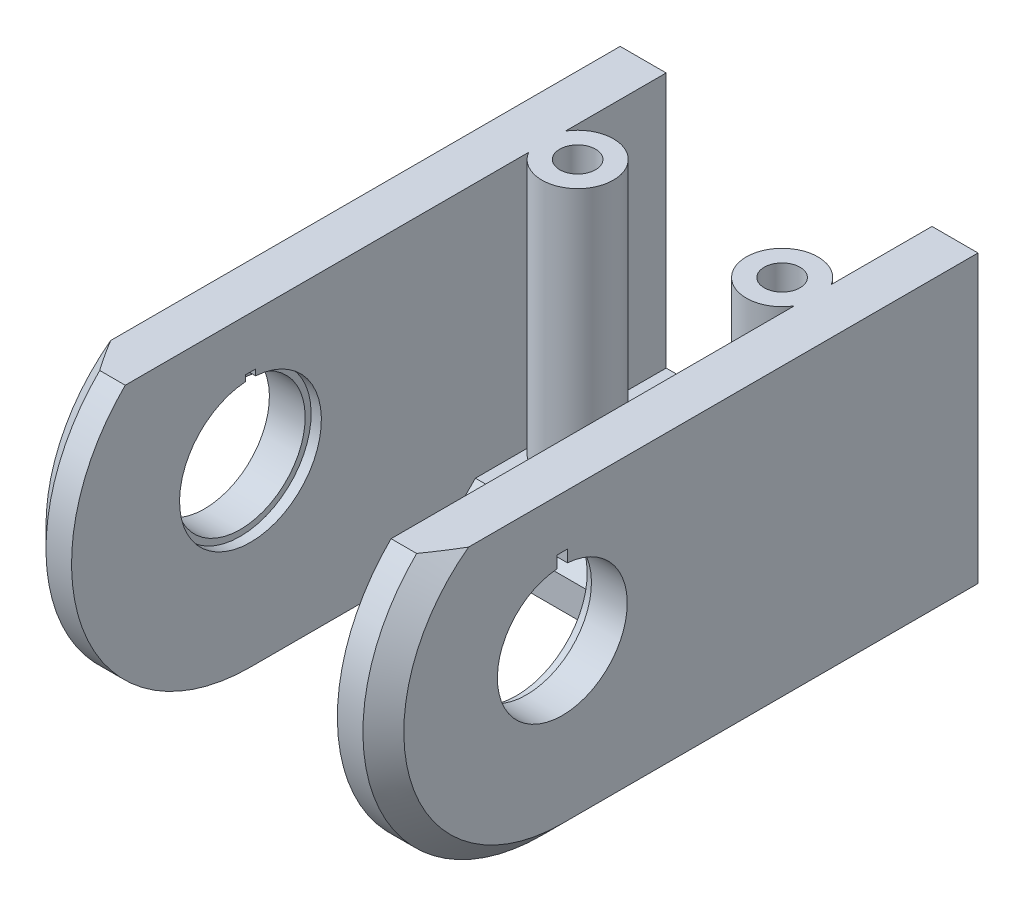
ISO-10303-21;
HEADER;
FILE_DESCRIPTION(('STEP AP214'),'2;1');
FILE_NAME('part.step','',(''),(''),'','','');
FILE_SCHEMA(('AUTOMOTIVE_DESIGN { 1 0 10303 214 1 1 1 1 }'));
ENDSEC;
DATA;
#1=APPLICATION_CONTEXT('core data for automotive mechanical design processes');
#2=APPLICATION_PROTOCOL_DEFINITION('international standard','automotive_design',2000,#1);
#3=PRODUCT_CONTEXT('',#1,'mechanical');
#4=PRODUCT('Part','Part','',(#3));
#5=PRODUCT_RELATED_PRODUCT_CATEGORY('part','',(#4));
#6=PRODUCT_DEFINITION_FORMATION('','',#4);
#7=PRODUCT_DEFINITION_CONTEXT('part definition',#1,'design');
#8=PRODUCT_DEFINITION('design','',#6,#7);
#9=PRODUCT_DEFINITION_SHAPE('','',#8);
#10=(LENGTH_UNIT() NAMED_UNIT(*) SI_UNIT(.MILLI.,.METRE.));
#11=(NAMED_UNIT(*) PLANE_ANGLE_UNIT() SI_UNIT($,.RADIAN.));
#12=(NAMED_UNIT(*) SI_UNIT($,.STERADIAN.) SOLID_ANGLE_UNIT());
#13=UNCERTAINTY_MEASURE_WITH_UNIT(LENGTH_MEASURE(1.E-05),#10,'distance_accuracy_value','');
#14=(GEOMETRIC_REPRESENTATION_CONTEXT(3) GLOBAL_UNCERTAINTY_ASSIGNED_CONTEXT((#13)) GLOBAL_UNIT_ASSIGNED_CONTEXT((#10,
#11,#12)) REPRESENTATION_CONTEXT('',''));
#15=CARTESIAN_POINT('',(0.,0.,0.));
#16=DIRECTION('',(0.,0.,1.));
#17=DIRECTION('',(1.,0.,0.));
#18=AXIS2_PLACEMENT_3D('',#15,#16,#17);
#19=CARTESIAN_POINT('',(17.5,0.,75.));
#20=DIRECTION('',(-1.,0.,0.));
#21=DIRECTION('',(0.,0.,1.));
#22=AXIS2_PLACEMENT_3D('',#19,#20,#21);
#23=CYLINDRICAL_SURFACE('',#22,6.35);
#24=DIRECTION('',(-1.,0.,0.));
#25=VECTOR('',#24,1.);
#26=CARTESIAN_POINT('',(17.5,6.33028435380275,74.5));
#27=LINE('',#26,#25);
#28=CARTESIAN_POINT('',(-17.5,6.33028435380275,74.5));
#29=VERTEX_POINT('',#28);
#30=CARTESIAN_POINT('',(-14.,6.33028435380275,74.5));
#31=VERTEX_POINT('',#30);
#32=EDGE_CURVE('E283',#29,#31,#27,.F.);
#33=ORIENTED_EDGE('',*,*,#32,.F.);
#34=CARTESIAN_POINT('',(-17.5,0.,75.));
#35=DIRECTION('',(1.,0.,0.));
#36=DIRECTION('',(0.,0.,-1.));
#37=AXIS2_PLACEMENT_3D('',#34,#35,#36);
#38=CIRCLE('',#37,6.35);
#39=CARTESIAN_POINT('',(-17.5,6.33028435380275,75.5));
#40=VERTEX_POINT('',#39);
#41=EDGE_CURVE('E410',#40,#29,#38,.T.);
#42=ORIENTED_EDGE('',*,*,#41,.F.);
#43=DIRECTION('',(-1.,0.,0.));
#44=VECTOR('',#43,1.);
#45=CARTESIAN_POINT('',(17.5,6.33028435380275,75.5));
#46=LINE('',#45,#44);
#47=CARTESIAN_POINT('',(-14.,6.33028435380275,75.5));
#48=VERTEX_POINT('',#47);
#49=EDGE_CURVE('E267',#48,#40,#46,.T.);
#50=ORIENTED_EDGE('',*,*,#49,.F.);
#51=CARTESIAN_POINT('',(-14.,0.,75.));
#52=DIRECTION('',(1.,0.,0.));
#53=DIRECTION('',(0.,0.,-1.));
#54=AXIS2_PLACEMENT_3D('',#51,#52,#53);
#55=CIRCLE('',#54,6.35);
#56=EDGE_CURVE('E306',#48,#31,#55,.T.);
#57=ORIENTED_EDGE('',*,*,#56,.T.);
#58=EDGE_LOOP('',(#33,#42,#50,#57));
#59=FACE_BOUND('',#58,.T.);
#60=ADVANCED_FACE('F37',(#59),#23,.F.);
#61=CARTESIAN_POINT('',(10.,-22.4497474683058,46.));
#62=DIRECTION('',(0.,1.,0.));
#63=DIRECTION('',(0.,0.,1.));
#64=AXIS2_PLACEMENT_3D('',#61,#62,#63);
#65=CYLINDRICAL_SURFACE('',#64,1.75);
#66=CARTESIAN_POINT('',(10.,12.5,46.));
#67=DIRECTION('',(0.,-1.,0.));
#68=DIRECTION('',(0.,0.,1.));
#69=AXIS2_PLACEMENT_3D('',#66,#67,#68);
#70=CIRCLE('',#69,1.75);
#71=CARTESIAN_POINT('',(10.,12.5,47.75));
#72=VERTEX_POINT('',#71);
#73=EDGE_CURVE('E316',#72,#72,#70,.T.);
#74=ORIENTED_EDGE('',*,*,#73,.F.);
#75=EDGE_LOOP('',(#74));
#76=FACE_BOUND('',#75,.T.);
#77=CARTESIAN_POINT('',(10.,-14.,46.));
#78=DIRECTION('',(0.,-1.,0.));
#79=DIRECTION('',(0.,0.,-1.));
#80=AXIS2_PLACEMENT_3D('',#77,#78,#79);
#81=CIRCLE('',#80,1.75);
#82=CARTESIAN_POINT('',(10.,-14.,44.25));
#83=VERTEX_POINT('',#82);
#84=EDGE_CURVE('E312',#83,#83,#81,.T.);
#85=ORIENTED_EDGE('',*,*,#84,.T.);
#86=EDGE_LOOP('',(#85));
#87=FACE_BOUND('',#86,.T.);
#88=ADVANCED_FACE('F501',(#76,#87),#65,.F.);
#89=CARTESIAN_POINT('',(13.,0.,-75.));
#90=DIRECTION('',(1.,0.,0.));
#91=DIRECTION('',(0.,0.,-1.));
#92=AXIS2_PLACEMENT_3D('',#89,#90,#91);
#93=PLANE('',#92);
#94=CARTESIAN_POINT('',(13.,0.,75.));
#95=DIRECTION('',(-1.,0.,0.));
#96=DIRECTION('',(0.,0.,1.));
#97=AXIS2_PLACEMENT_3D('',#94,#95,#96);
#98=CIRCLE('',#97,6.935);
#99=CARTESIAN_POINT('',(13.,6.91695200214661,74.5));
#100=VERTEX_POINT('',#99);
#101=CARTESIAN_POINT('',(13.,6.91695200214661,75.5));
#102=VERTEX_POINT('',#101);
#103=EDGE_CURVE('E328',#100,#102,#98,.T.);
#104=ORIENTED_EDGE('',*,*,#103,.F.);
#105=DIRECTION('',(0.,1.,0.));
#106=VECTOR('',#105,1.);
#107=CARTESIAN_POINT('',(13.,0.,74.5));
#108=LINE('',#107,#106);
#109=CARTESIAN_POINT('',(13.,7.5,74.5));
#110=VERTEX_POINT('',#109);
#111=EDGE_CURVE('E295',#100,#110,#108,.T.);
#112=ORIENTED_EDGE('',*,*,#111,.T.);
#113=DIRECTION('',(0.,0.,1.));
#114=VECTOR('',#113,1.);
#115=CARTESIAN_POINT('',(13.,7.5,-75.));
#116=LINE('',#115,#114);
#117=CARTESIAN_POINT('',(13.,7.5,75.5));
#118=VERTEX_POINT('',#117);
#119=EDGE_CURVE('E300',#110,#118,#116,.T.);
#120=ORIENTED_EDGE('',*,*,#119,.T.);
#121=DIRECTION('',(0.,-1.,0.));
#122=VECTOR('',#121,1.);
#123=CARTESIAN_POINT('',(13.,0.,75.5));
#124=LINE('',#123,#122);
#125=EDGE_CURVE('E239',#118,#102,#124,.T.);
#126=ORIENTED_EDGE('',*,*,#125,.T.);
#127=EDGE_LOOP('',(#104,#112,#120,#126));
#128=FACE_BOUND('',#127,.T.);
#129=DIRECTION('',(0.,0.,1.));
#130=VECTOR('',#129,1.);
#131=CARTESIAN_POINT('',(13.,12.5,92.5));
#132=LINE('',#131,#130);
#133=CARTESIAN_POINT('',(13.,12.5,47.802775637732));
#134=VERTEX_POINT('',#133);
#135=CARTESIAN_POINT('',(13.,12.5,87.2474487139159));
#136=VERTEX_POINT('',#135);
#137=EDGE_CURVE('E401',#134,#136,#132,.T.);
#138=ORIENTED_EDGE('',*,*,#137,.F.);
#139=DIRECTION('',(0.,-1.,0.));
#140=VECTOR('',#139,1.);
#141=CARTESIAN_POINT('',(13.,22.3994949366117,47.802775637732));
#142=LINE('',#141,#140);
#143=CARTESIAN_POINT('',(13.,-12.5,47.802775637732));
#144=VERTEX_POINT('',#143);
#145=EDGE_CURVE('E325',#134,#144,#142,.T.);
#146=ORIENTED_EDGE('',*,*,#145,.T.);
#147=DIRECTION('',(0.,0.,-1.));
#148=VECTOR('',#147,1.);
#149=CARTESIAN_POINT('',(13.,-12.5,55.));
#150=LINE('',#149,#148);
#151=CARTESIAN_POINT('',(13.,-12.5,53.));
#152=VERTEX_POINT('',#151);
#153=EDGE_CURVE('E398',#152,#144,#150,.T.);
#154=ORIENTED_EDGE('',*,*,#153,.F.);
#155=DIRECTION('',(0.,0.707106781186548,-0.707106781186548));
#156=VECTOR('',#155,1.);
#157=CARTESIAN_POINT('',(13.,57.75,-17.25));
#158=LINE('',#157,#156);
#159=CARTESIAN_POINT('',(13.,-14.5,55.));
#160=VERTEX_POINT('',#159);
#161=EDGE_CURVE('E607',#152,#160,#158,.F.);
#162=ORIENTED_EDGE('',*,*,#161,.T.);
#163=DIRECTION('',(0.,1.,0.));
#164=VECTOR('',#163,1.);
#165=CARTESIAN_POINT('',(13.,-12.5,55.));
#166=LINE('',#165,#164);
#167=CARTESIAN_POINT('',(13.,-17.5,55.));
#168=VERTEX_POINT('',#167);
#169=EDGE_CURVE('E393',#168,#160,#166,.T.);
#170=ORIENTED_EDGE('',*,*,#169,.F.);
#171=DIRECTION('',(0.,0.,-1.));
#172=VECTOR('',#171,1.);
#173=CARTESIAN_POINT('',(13.,-17.5,55.));
#174=LINE('',#173,#172);
#175=CARTESIAN_POINT('',(13.,-17.5,75.));
#176=VERTEX_POINT('',#175);
#177=EDGE_CURVE('E390',#176,#168,#174,.T.);
#178=ORIENTED_EDGE('',*,*,#177,.F.);
#179=CARTESIAN_POINT('',(13.,0.,75.));
#180=DIRECTION('',(1.,0.,0.));
#181=DIRECTION('',(0.,0.,-1.));
#182=AXIS2_PLACEMENT_3D('',#179,#180,#181);
#183=CIRCLE('',#182,17.5);
#184=EDGE_CURVE('E405',#136,#176,#183,.T.);
#185=ORIENTED_EDGE('',*,*,#184,.F.);
#186=EDGE_LOOP('',(#138,#146,#154,#162,#170,#178,#185));
#187=FACE_BOUND('',#186,.T.);
#188=ADVANCED_FACE('F508',(#128,#187),#93,.F.);
#189=DIRECTION('',(-1.,0.,0.));
#190=VECTOR('',#189,1.);
#191=CARTESIAN_POINT('',(17.5,6.33028435380275,74.5));
#192=LINE('',#191,#190);
#193=CARTESIAN_POINT('',(14.,6.33028435380275,74.5));
#194=VERTEX_POINT('',#193);
#195=CARTESIAN_POINT('',(17.5,6.33028435380275,74.5));
#196=VERTEX_POINT('',#195);
#197=EDGE_CURVE('E293',#194,#196,#192,.F.);
#198=ORIENTED_EDGE('',*,*,#197,.F.);
#199=CARTESIAN_POINT('',(14.,0.,75.));
#200=DIRECTION('',(-1.,0.,0.));
#201=DIRECTION('',(0.,0.,1.));
#202=AXIS2_PLACEMENT_3D('',#199,#200,#201);
#203=CIRCLE('',#202,6.35);
#204=CARTESIAN_POINT('',(14.,6.33028435380275,75.5));
#205=VERTEX_POINT('',#204);
#206=EDGE_CURVE('E332',#194,#205,#203,.T.);
#207=ORIENTED_EDGE('',*,*,#206,.T.);
#208=DIRECTION('',(-1.,0.,0.));
#209=VECTOR('',#208,1.);
#210=CARTESIAN_POINT('',(17.5,6.33028435380275,75.5));
#211=LINE('',#210,#209);
#212=CARTESIAN_POINT('',(17.5,6.33028435380275,75.5));
#213=VERTEX_POINT('',#212);
#214=EDGE_CURVE('E53',#213,#205,#211,.T.);
#215=ORIENTED_EDGE('',*,*,#214,.F.);
#216=CARTESIAN_POINT('',(17.5,0.,75.));
#217=DIRECTION('',(1.,0.,0.));
#218=DIRECTION('',(0.,0.,-1.));
#219=AXIS2_PLACEMENT_3D('',#216,#217,#218);
#220=CIRCLE('',#219,6.35);
#221=EDGE_CURVE('E258',#213,#196,#220,.T.);
#222=ORIENTED_EDGE('',*,*,#221,.T.);
#223=EDGE_LOOP('',(#198,#207,#215,#222));
#224=FACE_BOUND('',#223,.T.);
#225=ADVANCED_FACE('F504',(#224),#23,.F.);
#226=CARTESIAN_POINT('',(17.5,12.5,87.2474487139159));
#227=DIRECTION('',(0.,-1.,0.));
#228=DIRECTION('',(0.,0.,-1.));
#229=AXIS2_PLACEMENT_3D('',#226,#227,#228);
#230=PLANE('',#229);
#231=ORIENTED_EDGE('',*,*,#73,.T.);
#232=EDGE_LOOP('',(#231));
#233=FACE_BOUND('',#232,.T.);
#234=CARTESIAN_POINT('',(13.,12.5,34.3424314864507));
#235=VERTEX_POINT('',#234);
#236=CARTESIAN_POINT('',(13.,12.5,44.197224362268));
#237=VERTEX_POINT('',#236);
#238=EDGE_CURVE('E379',#235,#237,#132,.T.);
#239=ORIENTED_EDGE('',*,*,#238,.T.);
#240=CARTESIAN_POINT('',(10.,12.5,46.));
#241=DIRECTION('',(0.,-1.,0.));
#242=DIRECTION('',(0.,0.,-1.));
#243=AXIS2_PLACEMENT_3D('',#240,#241,#242);
#244=CIRCLE('',#243,3.50000000000001);
#245=EDGE_CURVE('E319',#237,#134,#244,.F.);
#246=ORIENTED_EDGE('',*,*,#245,.T.);
#247=ORIENTED_EDGE('',*,*,#137,.T.);
#248=DIRECTION('',(-1.,0.,0.));
#249=VECTOR('',#248,1.);
#250=CARTESIAN_POINT('',(17.5,12.5,87.2474487139159));
#251=LINE('',#250,#249);
#252=CARTESIAN_POINT('',(15.5,12.5,87.2474487139159));
#253=VERTEX_POINT('',#252);
#254=EDGE_CURVE('E419',#253,#136,#251,.T.);
#255=ORIENTED_EDGE('',*,*,#254,.F.);
#256=CARTESIAN_POINT('',(15.5,12.5,87.2474487139159));
#257=CARTESIAN_POINT('',(15.6756172945295,12.5,86.9964877108867));
#258=CARTESIAN_POINT('',(15.8494169532669,12.5,86.7442419059624));
#259=CARTESIAN_POINT('',(16.1927194087836,12.5,86.2369787479366));
#260=CARTESIAN_POINT('',(16.3622237420843,12.5,85.9819624339059));
#261=CARTESIAN_POINT('',(16.6964135222086,12.5,85.4687573416287));
#262=CARTESIAN_POINT('',(16.8610986444784,12.5,85.210568351371));
#263=CARTESIAN_POINT('',(17.1849216002896,12.5,84.6906080472939));
#264=CARTESIAN_POINT('',(17.3440573963148,12.5,84.4288354658246));
#265=CARTESIAN_POINT('',(17.5,12.5,84.1651513899116));
#266=B_SPLINE_CURVE_WITH_KNOTS('',3,(#256,#257,#258,#259,#260,#261,#262,#263,#264,#265),
.UNSPECIFIED.,.F.,.F.,(4,2,2,2,4),(0.,0.918922488747973,1.83751148308626,2.75616219883708,
3.67514673333104),.UNSPECIFIED.);
#267=CARTESIAN_POINT('',(17.5,12.5,84.1651513899117));
#268=VERTEX_POINT('',#267);
#269=EDGE_CURVE('E438',#253,#268,#266,.T.);
#270=ORIENTED_EDGE('',*,*,#269,.T.);
#271=DIRECTION('',(0.,0.,1.));
#272=VECTOR('',#271,1.);
#273=CARTESIAN_POINT('',(17.5,12.5,87.2474487139159));
#274=LINE('',#273,#272);
#275=CARTESIAN_POINT('',(17.5,12.5,34.3424314864507));
#276=VERTEX_POINT('',#275);
#277=EDGE_CURVE('E415',#276,#268,#274,.T.);
#278=ORIENTED_EDGE('',*,*,#277,.F.);
#279=DIRECTION('',(-1.,0.,0.));
#280=VECTOR('',#279,1.);
#281=CARTESIAN_POINT('',(17.5,12.5,34.3424314864507));
#282=LINE('',#281,#280);
#283=EDGE_CURVE('E351',#276,#235,#282,.T.);
#284=ORIENTED_EDGE('',*,*,#283,.T.);
#285=EDGE_LOOP('',(#239,#246,#247,#255,#270,#278,#284));
#286=FACE_BOUND('',#285,.T.);
#287=ADVANCED_FACE('F464',(#233,#286),#230,.F.);
#288=CARTESIAN_POINT('',(-10.,-22.4497474683058,46.));
#289=DIRECTION('',(0.,1.,0.));
#290=DIRECTION('',(0.,0.,1.));
#291=AXIS2_PLACEMENT_3D('',#288,#289,#290);
#292=CYLINDRICAL_SURFACE('',#291,1.75);
#293=CARTESIAN_POINT('',(-10.,12.5,46.));
#294=DIRECTION('',(0.,1.,0.));
#295=DIRECTION('',(0.,0.,1.));
#296=AXIS2_PLACEMENT_3D('',#293,#294,#295);
#297=CIRCLE('',#296,1.75);
#298=CARTESIAN_POINT('',(-10.,12.5,47.75));
#299=VERTEX_POINT('',#298);
#300=EDGE_CURVE('E364',#299,#299,#297,.T.);
#301=ORIENTED_EDGE('',*,*,#300,.T.);
#302=EDGE_LOOP('',(#301));
#303=FACE_BOUND('',#302,.T.);
#304=CARTESIAN_POINT('',(-10.,-14.,46.));
#305=DIRECTION('',(0.,-1.,0.));
#306=DIRECTION('',(0.,0.,-1.));
#307=AXIS2_PLACEMENT_3D('',#304,#305,#306);
#308=CIRCLE('',#307,1.75);
#309=CARTESIAN_POINT('',(-10.,-14.,44.25));
#310=VERTEX_POINT('',#309);
#311=EDGE_CURVE('E360',#310,#310,#308,.F.);
#312=ORIENTED_EDGE('',*,*,#311,.F.);
#313=EDGE_LOOP('',(#312));
#314=FACE_BOUND('',#313,.T.);
#315=ADVANCED_FACE('F519',(#303,#314),#292,.F.);
#316=CARTESIAN_POINT('',(-13.,0.,-75.));
#317=DIRECTION('',(1.,0.,0.));
#318=DIRECTION('',(0.,0.,-1.));
#319=AXIS2_PLACEMENT_3D('',#316,#317,#318);
#320=PLANE('',#319);
#321=DIRECTION('',(0.,1.,0.));
#322=VECTOR('',#321,1.);
#323=CARTESIAN_POINT('',(-13.,0.,74.5));
#324=LINE('',#323,#322);
#325=CARTESIAN_POINT('',(-13.,6.91695200214661,74.5));
#326=VERTEX_POINT('',#325);
#327=CARTESIAN_POINT('',(-13.,7.5,74.5));
#328=VERTEX_POINT('',#327);
#329=EDGE_CURVE('E281',#326,#328,#324,.T.);
#330=ORIENTED_EDGE('',*,*,#329,.F.);
#331=CARTESIAN_POINT('',(-13.,0.,75.));
#332=DIRECTION('',(-1.,0.,0.));
#333=DIRECTION('',(0.,0.,1.));
#334=AXIS2_PLACEMENT_3D('',#331,#332,#333);
#335=CIRCLE('',#334,6.935);
#336=CARTESIAN_POINT('',(-13.,6.91695200214661,75.5));
#337=VERTEX_POINT('',#336);
#338=EDGE_CURVE('E302',#326,#337,#335,.T.);
#339=ORIENTED_EDGE('',*,*,#338,.T.);
#340=DIRECTION('',(0.,-1.,0.));
#341=VECTOR('',#340,1.);
#342=CARTESIAN_POINT('',(-13.,0.,75.5));
#343=LINE('',#342,#341);
#344=CARTESIAN_POINT('',(-13.,7.5,75.5));
#345=VERTEX_POINT('',#344);
#346=EDGE_CURVE('E265',#345,#337,#343,.T.);
#347=ORIENTED_EDGE('',*,*,#346,.F.);
#348=DIRECTION('',(0.,0.,1.));
#349=VECTOR('',#348,1.);
#350=CARTESIAN_POINT('',(-13.,7.5,-75.));
#351=LINE('',#350,#349);
#352=EDGE_CURVE('E298',#328,#345,#351,.T.);
#353=ORIENTED_EDGE('',*,*,#352,.F.);
#354=EDGE_LOOP('',(#330,#339,#347,#353));
#355=FACE_BOUND('',#354,.T.);
#356=DIRECTION('',(0.,0.,-1.));
#357=VECTOR('',#356,1.);
#358=CARTESIAN_POINT('',(-13.,-12.5,55.));
#359=LINE('',#358,#357);
#360=CARTESIAN_POINT('',(-13.,-12.5,53.));
#361=VERTEX_POINT('',#360);
#362=CARTESIAN_POINT('',(-13.,-12.5,47.802775637732));
#363=VERTEX_POINT('',#362);
#364=EDGE_CURVE('E383',#361,#363,#359,.T.);
#365=ORIENTED_EDGE('',*,*,#364,.T.);
#366=DIRECTION('',(0.,-1.,0.));
#367=VECTOR('',#366,1.);
#368=CARTESIAN_POINT('',(-13.,22.3994949366117,47.802775637732));
#369=LINE('',#368,#367);
#370=CARTESIAN_POINT('',(-13.,12.5,47.802775637732));
#371=VERTEX_POINT('',#370);
#372=EDGE_CURVE('E373',#363,#371,#369,.F.);
#373=ORIENTED_EDGE('',*,*,#372,.T.);
#374=DIRECTION('',(0.,0.,1.));
#375=VECTOR('',#374,1.);
#376=CARTESIAN_POINT('',(-13.,12.5,92.5));
#377=LINE('',#376,#375);
#378=CARTESIAN_POINT('',(-13.,12.5,87.2474487139159));
#379=VERTEX_POINT('',#378);
#380=EDGE_CURVE('E386',#371,#379,#377,.T.);
#381=ORIENTED_EDGE('',*,*,#380,.T.);
#382=CARTESIAN_POINT('',(-13.,0.,75.));
#383=DIRECTION('',(1.,0.,0.));
#384=DIRECTION('',(0.,0.,-1.));
#385=AXIS2_PLACEMENT_3D('',#382,#383,#384);
#386=CIRCLE('',#385,17.5);
#387=CARTESIAN_POINT('',(-13.,-17.5,75.));
#388=VERTEX_POINT('',#387);
#389=EDGE_CURVE('E408',#379,#388,#386,.T.);
#390=ORIENTED_EDGE('',*,*,#389,.T.);
#391=DIRECTION('',(0.,0.,-1.));
#392=VECTOR('',#391,1.);
#393=CARTESIAN_POINT('',(-13.,-17.5,55.));
#394=LINE('',#393,#392);
#395=CARTESIAN_POINT('',(-13.,-17.5,55.));
#396=VERTEX_POINT('',#395);
#397=EDGE_CURVE('E376',#388,#396,#394,.T.);
#398=ORIENTED_EDGE('',*,*,#397,.T.);
#399=DIRECTION('',(0.,1.,0.));
#400=VECTOR('',#399,1.);
#401=CARTESIAN_POINT('',(-13.,-12.5,55.));
#402=LINE('',#401,#400);
#403=CARTESIAN_POINT('',(-13.,-14.5,55.));
#404=VERTEX_POINT('',#403);
#405=EDGE_CURVE('E378',#396,#404,#402,.T.);
#406=ORIENTED_EDGE('',*,*,#405,.T.);
#407=DIRECTION('',(0.,-0.707106781186548,0.707106781186548));
#408=VECTOR('',#407,1.);
#409=CARTESIAN_POINT('',(-13.,-12.5,53.));
#410=LINE('',#409,#408);
#411=EDGE_CURVE('E578',#404,#361,#410,.F.);
#412=ORIENTED_EDGE('',*,*,#411,.T.);
#413=EDGE_LOOP('',(#365,#373,#381,#390,#398,#406,#412));
#414=FACE_BOUND('',#413,.T.);
#415=ADVANCED_FACE('F569',(#355,#414),#320,.T.);
#416=DIRECTION('',(0.,-1.,0.));
#417=VECTOR('',#416,1.);
#418=CARTESIAN_POINT('',(-13.,0.,34.3424314864507));
#419=LINE('',#418,#417);
#420=CARTESIAN_POINT('',(-13.,12.5,34.3424314864507));
#421=VERTEX_POINT('',#420);
#422=CARTESIAN_POINT('',(-13.,-12.5,34.3424314864507));
#423=VERTEX_POINT('',#422);
#424=EDGE_CURVE('E354',#421,#423,#419,.T.);
#425=ORIENTED_EDGE('',*,*,#424,.F.);
#426=CARTESIAN_POINT('',(-13.,12.5,44.197224362268));
#427=VERTEX_POINT('',#426);
#428=EDGE_CURVE('E387',#421,#427,#377,.T.);
#429=ORIENTED_EDGE('',*,*,#428,.T.);
#430=DIRECTION('',(0.,-1.,0.));
#431=VECTOR('',#430,1.);
#432=CARTESIAN_POINT('',(-13.,22.3994949366117,44.197224362268));
#433=LINE('',#432,#431);
#434=CARTESIAN_POINT('',(-13.,-12.5,44.197224362268));
#435=VERTEX_POINT('',#434);
#436=EDGE_CURVE('E370',#427,#435,#433,.T.);
#437=ORIENTED_EDGE('',*,*,#436,.T.);
#438=EDGE_CURVE('E382',#435,#423,#359,.T.);
#439=ORIENTED_EDGE('',*,*,#438,.T.);
#440=EDGE_LOOP('',(#425,#429,#437,#439));
#441=FACE_BOUND('',#440,.T.);
#442=ADVANCED_FACE('F572',(#441),#320,.T.);
#443=CARTESIAN_POINT('',(17.5,0.,75.));
#444=DIRECTION('',(-1.,0.,0.));
#445=DIRECTION('',(0.,0.,1.));
#446=AXIS2_PLACEMENT_3D('',#443,#444,#445);
#447=CYLINDRICAL_SURFACE('',#446,17.5);
#448=CARTESIAN_POINT('',(-15.5,12.5,87.2474487139159));
#449=VERTEX_POINT('',#448);
#450=EDGE_CURVE('E417',#379,#449,#251,.T.);
#451=ORIENTED_EDGE('',*,*,#450,.T.);
#452=CARTESIAN_POINT('',(-15.5,0.,75.));
#453=DIRECTION('',(1.,0.,0.));
#454=DIRECTION('',(0.,0.,-1.));
#455=AXIS2_PLACEMENT_3D('',#452,#453,#454);
#456=CIRCLE('',#455,17.5);
#457=CARTESIAN_POINT('',(-15.5,-17.5,75.));
#458=VERTEX_POINT('',#457);
#459=EDGE_CURVE('E430',#449,#458,#456,.T.);
#460=ORIENTED_EDGE('',*,*,#459,.T.);
#461=DIRECTION('',(-1.,0.,0.));
#462=VECTOR('',#461,1.);
#463=CARTESIAN_POINT('',(17.5,-17.5,75.));
#464=LINE('',#463,#462);
#465=EDGE_CURVE('E422',#388,#458,#464,.T.);
#466=ORIENTED_EDGE('',*,*,#465,.F.);
#467=ORIENTED_EDGE('',*,*,#389,.F.);
#468=EDGE_LOOP('',(#451,#460,#466,#467));
#469=FACE_BOUND('',#468,.T.);
#470=ADVANCED_FACE('F470',(#469),#447,.T.);
#471=CARTESIAN_POINT('',(17.5,-17.5,75.));
#472=DIRECTION('',(0.,1.,0.));
#473=DIRECTION('',(0.,0.,1.));
#474=AXIS2_PLACEMENT_3D('',#471,#472,#473);
#475=PLANE('',#474);
#476=CARTESIAN_POINT('',(10.,-17.5,46.));
#477=DIRECTION('',(0.,1.,0.));
#478=DIRECTION('',(0.,0.,-1.));
#479=AXIS2_PLACEMENT_3D('',#476,#477,#478);
#480=CIRCLE('',#479,2.5);
#481=CARTESIAN_POINT('',(10.,-17.5,43.5));
#482=VERTEX_POINT('',#481);
#483=EDGE_CURVE('E313',#482,#482,#480,.T.);
#484=ORIENTED_EDGE('',*,*,#483,.T.);
#485=EDGE_LOOP('',(#484));
#486=FACE_BOUND('',#485,.T.);
#487=CARTESIAN_POINT('',(-10.,-17.5,46.));
#488=DIRECTION('',(0.,-1.,0.));
#489=DIRECTION('',(0.,0.,-1.));
#490=AXIS2_PLACEMENT_3D('',#487,#488,#489);
#491=CIRCLE('',#490,2.5);
#492=CARTESIAN_POINT('',(-10.,-17.5,43.5));
#493=VERTEX_POINT('',#492);
#494=EDGE_CURVE('E361',#493,#493,#491,.T.);
#495=ORIENTED_EDGE('',*,*,#494,.F.);
#496=EDGE_LOOP('',(#495));
#497=FACE_BOUND('',#496,.T.);
#498=DIRECTION('',(0.,0.,-1.));
#499=VECTOR('',#498,1.);
#500=CARTESIAN_POINT('',(-15.5,-17.5,75.));
#501=LINE('',#500,#499);
#502=CARTESIAN_POINT('',(-15.5,-17.5,34.3424314864507));
#503=VERTEX_POINT('',#502);
#504=EDGE_CURVE('E601',#458,#503,#501,.T.);
#505=ORIENTED_EDGE('',*,*,#504,.T.);
#506=DIRECTION('',(1.,0.,0.));
#507=VECTOR('',#506,1.);
#508=CARTESIAN_POINT('',(17.5,-17.5,34.3424314864507));
#509=LINE('',#508,#507);
#510=CARTESIAN_POINT('',(15.5,-17.5,34.3424314864507));
#511=VERTEX_POINT('',#510);
#512=EDGE_CURVE('E338',#503,#511,#509,.T.);
#513=ORIENTED_EDGE('',*,*,#512,.T.);
#514=DIRECTION('',(0.,0.,1.));
#515=VECTOR('',#514,1.);
#516=CARTESIAN_POINT('',(15.5,-17.5,75.));
#517=LINE('',#516,#515);
#518=CARTESIAN_POINT('',(15.5,-17.5,75.));
#519=VERTEX_POINT('',#518);
#520=EDGE_CURVE('E925',#511,#519,#517,.T.);
#521=ORIENTED_EDGE('',*,*,#520,.T.);
#522=EDGE_CURVE('E423',#519,#176,#464,.T.);
#523=ORIENTED_EDGE('',*,*,#522,.T.);
#524=ORIENTED_EDGE('',*,*,#177,.T.);
#525=DIRECTION('',(1.,0.,0.));
#526=VECTOR('',#525,1.);
#527=CARTESIAN_POINT('',(-13.,-17.5,55.));
#528=LINE('',#527,#526);
#529=EDGE_CURVE('E389',#396,#168,#528,.T.);
#530=ORIENTED_EDGE('',*,*,#529,.F.);
#531=ORIENTED_EDGE('',*,*,#397,.F.);
#532=ORIENTED_EDGE('',*,*,#465,.T.);
#533=EDGE_LOOP('',(#505,#513,#521,#523,#524,#530,#531,#532));
#534=FACE_BOUND('',#533,.T.);
#535=ADVANCED_FACE('F462',(#486,#497,#534),#475,.F.);
#536=ORIENTED_EDGE('',*,*,#300,.F.);
#537=EDGE_LOOP('',(#536));
#538=FACE_BOUND('',#537,.T.);
#539=ORIENTED_EDGE('',*,*,#428,.F.);
#540=CARTESIAN_POINT('',(-17.5,12.5,34.3424314864507));
#541=VERTEX_POINT('',#540);
#542=EDGE_CURVE('E355',#421,#541,#282,.T.);
#543=ORIENTED_EDGE('',*,*,#542,.T.);
#544=DIRECTION('',(0.,0.,1.));
#545=VECTOR('',#544,1.);
#546=CARTESIAN_POINT('',(-17.5,12.5,87.2474487139159));
#547=LINE('',#546,#545);
#548=CARTESIAN_POINT('',(-17.5,12.5,84.1651513899117));
#549=VERTEX_POINT('',#548);
#550=EDGE_CURVE('E412',#541,#549,#547,.T.);
#551=ORIENTED_EDGE('',*,*,#550,.T.);
#552=CARTESIAN_POINT('',(-17.5,12.5,84.1651513899117));
#553=CARTESIAN_POINT('',(-17.3440573963148,12.5,84.4288354658246));
#554=CARTESIAN_POINT('',(-17.1849216002896,12.5,84.6906080472939));
#555=CARTESIAN_POINT('',(-16.8610986444784,12.5,85.210568351371));
#556=CARTESIAN_POINT('',(-16.6964135222086,12.5,85.4687573416288));
#557=CARTESIAN_POINT('',(-16.3622237420843,12.5,85.9819624339059));
#558=CARTESIAN_POINT('',(-16.1927194087836,12.5,86.2369787479367));
#559=CARTESIAN_POINT('',(-15.8494169532669,12.5,86.7442419059624));
#560=CARTESIAN_POINT('',(-15.6756172945295,12.5,86.9964877108867));
#561=CARTESIAN_POINT('',(-15.5,12.5,87.2474487139159));
#562=B_SPLINE_CURVE_WITH_KNOTS('',3,(#552,#553,#554,#555,#556,#557,#558,#559,#560,#561),
.UNSPECIFIED.,.F.,.F.,(4,2,2,2,4),(0.,0.918984534493964,1.83763525024478,2.75622424458305,
3.67514673333103),.UNSPECIFIED.);
#563=EDGE_CURVE('E446',#549,#449,#562,.T.);
#564=ORIENTED_EDGE('',*,*,#563,.T.);
#565=ORIENTED_EDGE('',*,*,#450,.F.);
#566=ORIENTED_EDGE('',*,*,#380,.F.);
#567=CARTESIAN_POINT('',(-10.,12.5,46.));
#568=DIRECTION('',(0.,-1.,0.));
#569=DIRECTION('',(0.,0.,-1.));
#570=AXIS2_PLACEMENT_3D('',#567,#568,#569);
#571=CIRCLE('',#570,3.50000000000001);
#572=EDGE_CURVE('E367',#427,#371,#571,.T.);
#573=ORIENTED_EDGE('',*,*,#572,.F.);
#574=EDGE_LOOP('',(#539,#543,#551,#564,#565,#566,#573));
#575=FACE_BOUND('',#574,.T.);
#576=ADVANCED_FACE('F457',(#538,#575),#230,.F.);
#577=CARTESIAN_POINT('',(17.5,0.,75.));
#578=DIRECTION('',(1.,0.,0.));
#579=DIRECTION('',(0.,0.,-1.));
#580=AXIS2_PLACEMENT_3D('',#577,#578,#579);
#581=PLANE('',#580);
#582=DIRECTION('',(0.,-1.,0.));
#583=VECTOR('',#582,1.);
#584=CARTESIAN_POINT('',(17.5,0.,74.5));
#585=LINE('',#584,#583);
#586=CARTESIAN_POINT('',(17.5,7.5,74.5));
#587=VERTEX_POINT('',#586);
#588=EDGE_CURVE('E259',#587,#196,#585,.T.);
#589=ORIENTED_EDGE('',*,*,#588,.T.);
#590=ORIENTED_EDGE('',*,*,#221,.F.);
#591=DIRECTION('',(0.,1.,0.));
#592=VECTOR('',#591,1.);
#593=CARTESIAN_POINT('',(17.5,0.,75.5));
#594=LINE('',#593,#592);
#595=CARTESIAN_POINT('',(17.5,7.5,75.5));
#596=VERTEX_POINT('',#595);
#597=EDGE_CURVE('E237',#213,#596,#594,.T.);
#598=ORIENTED_EDGE('',*,*,#597,.T.);
#599=DIRECTION('',(0.,0.,-1.));
#600=VECTOR('',#599,1.);
#601=CARTESIAN_POINT('',(17.5,7.5,74.5));
#602=LINE('',#601,#600);
#603=EDGE_CURVE('E246',#596,#587,#602,.T.);
#604=ORIENTED_EDGE('',*,*,#603,.T.);
#605=EDGE_LOOP('',(#589,#590,#598,#604));
#606=FACE_BOUND('',#605,.T.);
#607=DIRECTION('',(0.,-1.,0.));
#608=VECTOR('',#607,1.);
#609=CARTESIAN_POINT('',(17.5,19.5108427592238,34.3424314864507));
#610=LINE('',#609,#608);
#611=CARTESIAN_POINT('',(17.5,-15.5,34.3424314864507));
#612=VERTEX_POINT('',#611);
#613=EDGE_CURVE('E339',#276,#612,#610,.T.);
#614=ORIENTED_EDGE('',*,*,#613,.F.);
#615=ORIENTED_EDGE('',*,*,#277,.T.);
#616=CARTESIAN_POINT('',(17.5,0.,75.));
#617=DIRECTION('',(1.,0.,0.));
#618=DIRECTION('',(0.,0.,-1.));
#619=AXIS2_PLACEMENT_3D('',#616,#617,#618);
#620=CIRCLE('',#619,15.5);
#621=CARTESIAN_POINT('',(17.5,-15.5,75.));
#622=VERTEX_POINT('',#621);
#623=EDGE_CURVE('E918',#268,#622,#620,.T.);
#624=ORIENTED_EDGE('',*,*,#623,.T.);
#625=DIRECTION('',(0.,0.,-1.));
#626=VECTOR('',#625,1.);
#627=CARTESIAN_POINT('',(17.5,-15.5,-75.));
#628=LINE('',#627,#626);
#629=EDGE_CURVE('E920',#622,#612,#628,.T.);
#630=ORIENTED_EDGE('',*,*,#629,.T.);
#631=EDGE_LOOP('',(#614,#615,#624,#630));
#632=FACE_BOUND('',#631,.T.);
#633=ADVANCED_FACE('F255',(#606,#632),#581,.T.);
#634=CARTESIAN_POINT('',(-17.5,0.,75.));
#635=DIRECTION('',(1.,0.,0.));
#636=DIRECTION('',(0.,0.,-1.));
#637=AXIS2_PLACEMENT_3D('',#634,#635,#636);
#638=PLANE('',#637);
#639=ORIENTED_EDGE('',*,*,#550,.F.);
#640=DIRECTION('',(0.,-1.,0.));
#641=VECTOR('',#640,1.);
#642=CARTESIAN_POINT('',(-17.5,19.5108427592238,34.3424314864507));
#643=LINE('',#642,#641);
#644=CARTESIAN_POINT('',(-17.5,-15.5,34.3424314864507));
#645=VERTEX_POINT('',#644);
#646=EDGE_CURVE('E335',#541,#645,#643,.T.);
#647=ORIENTED_EDGE('',*,*,#646,.T.);
#648=DIRECTION('',(0.,0.,1.));
#649=VECTOR('',#648,1.);
#650=CARTESIAN_POINT('',(-17.5,-15.5,75.));
#651=LINE('',#650,#649);
#652=CARTESIAN_POINT('',(-17.5,-15.5,75.));
#653=VERTEX_POINT('',#652);
#654=EDGE_CURVE('E433',#645,#653,#651,.T.);
#655=ORIENTED_EDGE('',*,*,#654,.T.);
#656=CARTESIAN_POINT('',(-17.5,0.,75.));
#657=DIRECTION('',(1.,0.,0.));
#658=DIRECTION('',(0.,0.,-1.));
#659=AXIS2_PLACEMENT_3D('',#656,#657,#658);
#660=CIRCLE('',#659,15.5);
#661=EDGE_CURVE('E435',#653,#549,#660,.F.);
#662=ORIENTED_EDGE('',*,*,#661,.T.);
#663=EDGE_LOOP('',(#639,#647,#655,#662));
#664=FACE_BOUND('',#663,.T.);
#665=ORIENTED_EDGE('',*,*,#41,.T.);
#666=DIRECTION('',(0.,1.,0.));
#667=VECTOR('',#666,1.);
#668=CARTESIAN_POINT('',(-17.5,0.,74.5));
#669=LINE('',#668,#667);
#670=CARTESIAN_POINT('',(-17.5,7.5,74.5));
#671=VERTEX_POINT('',#670);
#672=EDGE_CURVE('E285',#29,#671,#669,.T.);
#673=ORIENTED_EDGE('',*,*,#672,.T.);
#674=DIRECTION('',(0.,0.,1.));
#675=VECTOR('',#674,1.);
#676=CARTESIAN_POINT('',(-17.5,7.5,75.));
#677=LINE('',#676,#675);
#678=CARTESIAN_POINT('',(-17.5,7.5,75.5));
#679=VERTEX_POINT('',#678);
#680=EDGE_CURVE('E11',#671,#679,#677,.T.);
#681=ORIENTED_EDGE('',*,*,#680,.T.);
#682=DIRECTION('',(0.,-1.,0.));
#683=VECTOR('',#682,1.);
#684=CARTESIAN_POINT('',(-17.5,0.,75.5));
#685=LINE('',#684,#683);
#686=EDGE_CURVE('E269',#679,#40,#685,.T.);
#687=ORIENTED_EDGE('',*,*,#686,.T.);
#688=EDGE_LOOP('',(#665,#673,#681,#687));
#689=FACE_BOUND('',#688,.T.);
#690=ADVANCED_FACE('F465',(#664,#689),#638,.F.);
#691=ORIENTED_EDGE('',*,*,#522,.F.);
#692=CARTESIAN_POINT('',(15.5,0.,75.));
#693=DIRECTION('',(1.,0.,0.));
#694=DIRECTION('',(0.,0.,-1.));
#695=AXIS2_PLACEMENT_3D('',#692,#693,#694);
#696=CIRCLE('',#695,17.5);
#697=EDGE_CURVE('E610',#519,#253,#696,.F.);
#698=ORIENTED_EDGE('',*,*,#697,.T.);
#699=ORIENTED_EDGE('',*,*,#254,.T.);
#700=ORIENTED_EDGE('',*,*,#184,.T.);
#701=EDGE_LOOP('',(#691,#698,#699,#700));
#702=FACE_BOUND('',#701,.T.);
#703=ADVANCED_FACE('F472',(#702),#447,.T.);
#704=CARTESIAN_POINT('',(13.,-12.5,44.197224362268));
#705=VERTEX_POINT('',#704);
#706=CARTESIAN_POINT('',(13.,-12.5,34.3424314864507));
#707=VERTEX_POINT('',#706);
#708=EDGE_CURVE('E397',#705,#707,#150,.T.);
#709=ORIENTED_EDGE('',*,*,#708,.F.);
#710=DIRECTION('',(0.,-1.,0.));
#711=VECTOR('',#710,1.);
#712=CARTESIAN_POINT('',(13.,22.3994949366117,44.197224362268));
#713=LINE('',#712,#711);
#714=EDGE_CURVE('E322',#705,#237,#713,.F.);
#715=ORIENTED_EDGE('',*,*,#714,.T.);
#716=ORIENTED_EDGE('',*,*,#238,.F.);
#717=DIRECTION('',(0.,-1.,0.));
#718=VECTOR('',#717,1.);
#719=CARTESIAN_POINT('',(13.,0.,34.3424314864507));
#720=LINE('',#719,#718);
#721=EDGE_CURVE('E348',#235,#707,#720,.T.);
#722=ORIENTED_EDGE('',*,*,#721,.T.);
#723=EDGE_LOOP('',(#709,#715,#716,#722));
#724=FACE_BOUND('',#723,.T.);
#725=ADVANCED_FACE('F475',(#724),#93,.F.);
#726=CARTESIAN_POINT('',(-13.,-12.5,55.));
#727=DIRECTION('',(0.,-1.,0.));
#728=DIRECTION('',(0.,0.,-1.));
#729=AXIS2_PLACEMENT_3D('',#726,#727,#728);
#730=PLANE('',#729);
#731=ORIENTED_EDGE('',*,*,#153,.T.);
#732=CARTESIAN_POINT('',(10.,-12.5,46.));
#733=DIRECTION('',(0.,-1.,0.));
#734=DIRECTION('',(0.,0.,-1.));
#735=AXIS2_PLACEMENT_3D('',#732,#733,#734);
#736=CIRCLE('',#735,3.50000000000001);
#737=EDGE_CURVE('E536',#144,#705,#736,.T.);
#738=ORIENTED_EDGE('',*,*,#737,.T.);
#739=ORIENTED_EDGE('',*,*,#708,.T.);
#740=DIRECTION('',(-1.,0.,0.));
#741=VECTOR('',#740,1.);
#742=CARTESIAN_POINT('',(-13.,-12.5,34.3424314864507));
#743=LINE('',#742,#741);
#744=EDGE_CURVE('E345',#707,#423,#743,.T.);
#745=ORIENTED_EDGE('',*,*,#744,.T.);
#746=ORIENTED_EDGE('',*,*,#438,.F.);
#747=CARTESIAN_POINT('',(-10.,-12.5,46.));
#748=DIRECTION('',(0.,-1.,0.));
#749=DIRECTION('',(0.,0.,-1.));
#750=AXIS2_PLACEMENT_3D('',#747,#748,#749);
#751=CIRCLE('',#750,3.50000000000001);
#752=EDGE_CURVE('E585',#363,#435,#751,.F.);
#753=ORIENTED_EDGE('',*,*,#752,.F.);
#754=ORIENTED_EDGE('',*,*,#364,.F.);
#755=DIRECTION('',(1.,0.,0.));
#756=VECTOR('',#755,1.);
#757=CARTESIAN_POINT('',(-13.,-12.5,53.));
#758=LINE('',#757,#756);
#759=EDGE_CURVE('E425',#361,#152,#758,.T.);
#760=ORIENTED_EDGE('',*,*,#759,.T.);
#761=EDGE_LOOP('',(#731,#738,#739,#745,#746,#753,#754,#760));
#762=FACE_BOUND('',#761,.T.);
#763=ADVANCED_FACE('F632',(#762),#730,.F.);
#764=CARTESIAN_POINT('',(-13.,-12.5,55.));
#765=DIRECTION('',(0.,0.,-1.));
#766=DIRECTION('',(-1.,0.,0.));
#767=AXIS2_PLACEMENT_3D('',#764,#765,#766);
#768=PLANE('',#767);
#769=ORIENTED_EDGE('',*,*,#169,.T.);
#770=DIRECTION('',(-1.,0.,0.));
#771=VECTOR('',#770,1.);
#772=CARTESIAN_POINT('',(-13.,-14.5,55.));
#773=LINE('',#772,#771);
#774=EDGE_CURVE('E428',#160,#404,#773,.T.);
#775=ORIENTED_EDGE('',*,*,#774,.T.);
#776=ORIENTED_EDGE('',*,*,#405,.F.);
#777=ORIENTED_EDGE('',*,*,#529,.T.);
#778=EDGE_LOOP('',(#769,#775,#776,#777));
#779=FACE_BOUND('',#778,.T.);
#780=ADVANCED_FACE('F484',(#779),#768,.F.);
#781=CARTESIAN_POINT('',(-13.,-12.5,53.));
#782=DIRECTION('',(0.,-0.707106781186547,-0.707106781186547));
#783=DIRECTION('',(1.,0.,0.));
#784=AXIS2_PLACEMENT_3D('',#781,#782,#783);
#785=PLANE('',#784);
#786=ORIENTED_EDGE('',*,*,#411,.F.);
#787=ORIENTED_EDGE('',*,*,#774,.F.);
#788=ORIENTED_EDGE('',*,*,#161,.F.);
#789=ORIENTED_EDGE('',*,*,#759,.F.);
#790=EDGE_LOOP('',(#786,#787,#788,#789));
#791=FACE_BOUND('',#790,.T.);
#792=ADVANCED_FACE('F478',(#791),#785,.F.);
#793=CARTESIAN_POINT('',(-15.5,-17.5,75.));
#794=DIRECTION('',(0.707106781186547,0.707106781186547,0.));
#795=DIRECTION('',(0.,0.,-1.));
#796=AXIS2_PLACEMENT_3D('',#793,#794,#795);
#797=PLANE('',#796);
#798=DIRECTION('',(0.707106781186548,-0.707106781186548,0.));
#799=VECTOR('',#798,1.);
#800=CARTESIAN_POINT('',(-15.5,-17.5,34.3424314864507));
#801=LINE('',#800,#799);
#802=EDGE_CURVE('E343',#503,#645,#801,.F.);
#803=ORIENTED_EDGE('',*,*,#802,.F.);
#804=ORIENTED_EDGE('',*,*,#504,.F.);
#805=DIRECTION('',(0.707106781186547,-0.707106781186547,0.));
#806=VECTOR('',#805,1.);
#807=CARTESIAN_POINT('',(-17.5,-15.5,75.));
#808=LINE('',#807,#806);
#809=EDGE_CURVE('E394',#653,#458,#808,.T.);
#810=ORIENTED_EDGE('',*,*,#809,.F.);
#811=ORIENTED_EDGE('',*,*,#654,.F.);
#812=EDGE_LOOP('',(#803,#804,#810,#811));
#813=FACE_BOUND('',#812,.T.);
#814=ADVANCED_FACE('F483',(#813),#797,.F.);
#815=CARTESIAN_POINT('',(-15.5,0.,75.));
#816=DIRECTION('',(1.,0.,0.));
#817=DIRECTION('',(0.,0.,-1.));
#818=AXIS2_PLACEMENT_3D('',#815,#816,#817);
#819=CONICAL_SURFACE('',#818,17.5,0.785398163397448);
#820=ORIENTED_EDGE('',*,*,#563,.F.);
#821=ORIENTED_EDGE('',*,*,#661,.F.);
#822=ORIENTED_EDGE('',*,*,#809,.T.);
#823=ORIENTED_EDGE('',*,*,#459,.F.);
#824=EDGE_LOOP('',(#820,#821,#822,#823));
#825=FACE_BOUND('',#824,.T.);
#826=ADVANCED_FACE('F487',(#825),#819,.T.);
#827=CARTESIAN_POINT('',(17.5,-15.5,75.));
#828=DIRECTION('',(0.707106781186547,-0.707106781186547,0.));
#829=DIRECTION('',(0.,0.,1.));
#830=AXIS2_PLACEMENT_3D('',#827,#828,#829);
#831=PLANE('',#830);
#832=DIRECTION('',(-0.707106781186548,-0.707106781186548,0.));
#833=VECTOR('',#832,1.);
#834=CARTESIAN_POINT('',(17.5,-15.5,34.3424314864507));
#835=LINE('',#834,#833);
#836=EDGE_CURVE('E534',#612,#511,#835,.T.);
#837=ORIENTED_EDGE('',*,*,#836,.F.);
#838=ORIENTED_EDGE('',*,*,#629,.F.);
#839=DIRECTION('',(0.707106781186547,0.707106781186547,0.));
#840=VECTOR('',#839,1.);
#841=CARTESIAN_POINT('',(15.5,-17.5,75.));
#842=LINE('',#841,#840);
#843=EDGE_CURVE('E375',#519,#622,#842,.T.);
#844=ORIENTED_EDGE('',*,*,#843,.F.);
#845=ORIENTED_EDGE('',*,*,#520,.F.);
#846=EDGE_LOOP('',(#837,#838,#844,#845));
#847=FACE_BOUND('',#846,.T.);
#848=ADVANCED_FACE('F40',(#847),#831,.T.);
#849=CARTESIAN_POINT('',(17.5,0.,75.));
#850=DIRECTION('',(-1.,0.,0.));
#851=DIRECTION('',(0.,0.,1.));
#852=AXIS2_PLACEMENT_3D('',#849,#850,#851);
#853=CONICAL_SURFACE('',#852,15.5,0.785398163397448);
#854=ORIENTED_EDGE('',*,*,#269,.F.);
#855=ORIENTED_EDGE('',*,*,#697,.F.);
#856=ORIENTED_EDGE('',*,*,#843,.T.);
#857=ORIENTED_EDGE('',*,*,#623,.F.);
#858=EDGE_LOOP('',(#854,#855,#856,#857));
#859=FACE_BOUND('',#858,.T.);
#860=ADVANCED_FACE('F454',(#859),#853,.T.);
#861=CARTESIAN_POINT('',(-10.,22.3994949366117,46.));
#862=DIRECTION('',(0.,-1.,0.));
#863=DIRECTION('',(0.,0.,-1.));
#864=AXIS2_PLACEMENT_3D('',#861,#862,#863);
#865=CYLINDRICAL_SURFACE('',#864,3.50000000000001);
#866=ORIENTED_EDGE('',*,*,#372,.F.);
#867=ORIENTED_EDGE('',*,*,#752,.T.);
#868=ORIENTED_EDGE('',*,*,#436,.F.);
#869=ORIENTED_EDGE('',*,*,#572,.T.);
#870=EDGE_LOOP('',(#866,#867,#868,#869));
#871=FACE_BOUND('',#870,.T.);
#872=ADVANCED_FACE('F583',(#871),#865,.T.);
#873=CARTESIAN_POINT('',(-10.,-14.,46.));
#874=DIRECTION('',(0.,-1.,0.));
#875=DIRECTION('',(0.,0.,-1.));
#876=AXIS2_PLACEMENT_3D('',#873,#874,#875);
#877=PLANE('',#876);
#878=CARTESIAN_POINT('',(-10.,-14.,46.));
#879=DIRECTION('',(0.,-1.,0.));
#880=DIRECTION('',(0.,0.,-1.));
#881=AXIS2_PLACEMENT_3D('',#878,#879,#880);
#882=CIRCLE('',#881,2.5);
#883=CARTESIAN_POINT('',(-10.,-14.,43.5));
#884=VERTEX_POINT('',#883);
#885=EDGE_CURVE('E357',#884,#884,#882,.T.);
#886=ORIENTED_EDGE('',*,*,#885,.T.);
#887=EDGE_LOOP('',(#886));
#888=FACE_BOUND('',#887,.T.);
#889=ORIENTED_EDGE('',*,*,#311,.T.);
#890=EDGE_LOOP('',(#889));
#891=FACE_BOUND('',#890,.T.);
#892=ADVANCED_FACE('F618',(#888,#891),#877,.T.);
#893=CARTESIAN_POINT('',(-10.,-14.,46.));
#894=DIRECTION('',(0.,-1.,0.));
#895=DIRECTION('',(0.,0.,-1.));
#896=AXIS2_PLACEMENT_3D('',#893,#894,#895);
#897=CYLINDRICAL_SURFACE('',#896,2.5);
#898=ORIENTED_EDGE('',*,*,#885,.F.);
#899=EDGE_LOOP('',(#898));
#900=FACE_BOUND('',#899,.T.);
#901=ORIENTED_EDGE('',*,*,#494,.T.);
#902=EDGE_LOOP('',(#901));
#903=FACE_BOUND('',#902,.T.);
#904=ADVANCED_FACE('F627',(#900,#903),#897,.F.);
#905=CARTESIAN_POINT('',(-17.5,19.5108427592238,34.3424314864507));
#906=DIRECTION('',(0.,0.,1.));
#907=DIRECTION('',(0.,-1.,0.));
#908=AXIS2_PLACEMENT_3D('',#905,#906,#907);
#909=PLANE('',#908);
#910=ORIENTED_EDGE('',*,*,#424,.T.);
#911=ORIENTED_EDGE('',*,*,#744,.F.);
#912=ORIENTED_EDGE('',*,*,#721,.F.);
#913=ORIENTED_EDGE('',*,*,#283,.F.);
#914=ORIENTED_EDGE('',*,*,#613,.T.);
#915=ORIENTED_EDGE('',*,*,#836,.T.);
#916=ORIENTED_EDGE('',*,*,#512,.F.);
#917=ORIENTED_EDGE('',*,*,#802,.T.);
#918=ORIENTED_EDGE('',*,*,#646,.F.);
#919=ORIENTED_EDGE('',*,*,#542,.F.);
#920=EDGE_LOOP('',(#910,#911,#912,#913,#914,#915,#916,#917,#918,#919));
#921=FACE_BOUND('',#920,.T.);
#922=ADVANCED_FACE('F691',(#921),#909,.F.);
#923=CARTESIAN_POINT('',(14.,0.,75.));
#924=DIRECTION('',(-1.,0.,0.));
#925=DIRECTION('',(0.,0.,1.));
#926=AXIS2_PLACEMENT_3D('',#923,#924,#925);
#927=CYLINDRICAL_SURFACE('',#926,6.935);
#928=CARTESIAN_POINT('',(14.,0.,75.));
#929=DIRECTION('',(-1.,0.,0.));
#930=DIRECTION('',(0.,0.,1.));
#931=AXIS2_PLACEMENT_3D('',#928,#929,#930);
#932=CIRCLE('',#931,6.935);
#933=CARTESIAN_POINT('',(14.,6.91695200214661,74.5));
#934=VERTEX_POINT('',#933);
#935=CARTESIAN_POINT('',(14.,6.91695200214661,75.5));
#936=VERTEX_POINT('',#935);
#937=EDGE_CURVE('E329',#934,#936,#932,.T.);
#938=ORIENTED_EDGE('',*,*,#937,.F.);
#939=DIRECTION('',(-1.,0.,0.));
#940=VECTOR('',#939,1.);
#941=CARTESIAN_POINT('',(14.,6.91695200214661,74.5));
#942=LINE('',#941,#940);
#943=EDGE_CURVE('E290',#934,#100,#942,.T.);
#944=ORIENTED_EDGE('',*,*,#943,.T.);
#945=ORIENTED_EDGE('',*,*,#103,.T.);
#946=DIRECTION('',(-1.,0.,0.));
#947=VECTOR('',#946,1.);
#948=CARTESIAN_POINT('',(14.,6.91695200214661,75.5));
#949=LINE('',#948,#947);
#950=EDGE_CURVE('E274',#102,#936,#949,.F.);
#951=ORIENTED_EDGE('',*,*,#950,.T.);
#952=EDGE_LOOP('',(#938,#944,#945,#951));
#953=FACE_BOUND('',#952,.T.);
#954=ADVANCED_FACE('F726',(#953),#927,.F.);
#955=CARTESIAN_POINT('',(14.,0.,75.));
#956=DIRECTION('',(-1.,0.,0.));
#957=DIRECTION('',(0.,0.,1.));
#958=AXIS2_PLACEMENT_3D('',#955,#956,#957);
#959=PLANE('',#958);
#960=DIRECTION('',(0.,-1.,0.));
#961=VECTOR('',#960,1.);
#962=CARTESIAN_POINT('',(14.,0.,74.5));
#963=LINE('',#962,#961);
#964=EDGE_CURVE('E288',#934,#194,#963,.T.);
#965=ORIENTED_EDGE('',*,*,#964,.F.);
#966=ORIENTED_EDGE('',*,*,#937,.T.);
#967=DIRECTION('',(0.,1.,0.));
#968=VECTOR('',#967,1.);
#969=CARTESIAN_POINT('',(14.,0.,75.5));
#970=LINE('',#969,#968);
#971=EDGE_CURVE('E272',#205,#936,#970,.T.);
#972=ORIENTED_EDGE('',*,*,#971,.F.);
#973=ORIENTED_EDGE('',*,*,#206,.F.);
#974=EDGE_LOOP('',(#965,#966,#972,#973));
#975=FACE_BOUND('',#974,.T.);
#976=ADVANCED_FACE('F529',(#975),#959,.T.);
#977=CARTESIAN_POINT('',(10.,22.3994949366117,46.));
#978=DIRECTION('',(0.,-1.,0.));
#979=DIRECTION('',(0.,0.,-1.));
#980=AXIS2_PLACEMENT_3D('',#977,#978,#979);
#981=CYLINDRICAL_SURFACE('',#980,3.50000000000001);
#982=ORIENTED_EDGE('',*,*,#145,.F.);
#983=ORIENTED_EDGE('',*,*,#245,.F.);
#984=ORIENTED_EDGE('',*,*,#714,.F.);
#985=ORIENTED_EDGE('',*,*,#737,.F.);
#986=EDGE_LOOP('',(#982,#983,#984,#985));
#987=FACE_BOUND('',#986,.T.);
#988=ADVANCED_FACE('F768',(#987),#981,.T.);
#989=CARTESIAN_POINT('',(10.,-14.,46.));
#990=DIRECTION('',(0.,-1.,0.));
#991=DIRECTION('',(0.,0.,-1.));
#992=AXIS2_PLACEMENT_3D('',#989,#990,#991);
#993=CYLINDRICAL_SURFACE('',#992,2.5);
#994=CARTESIAN_POINT('',(10.,-14.,46.));
#995=DIRECTION('',(0.,1.,0.));
#996=DIRECTION('',(0.,0.,-1.));
#997=AXIS2_PLACEMENT_3D('',#994,#995,#996);
#998=CIRCLE('',#997,2.5);
#999=CARTESIAN_POINT('',(10.,-14.,43.5));
#1000=VERTEX_POINT('',#999);
#1001=EDGE_CURVE('E309',#1000,#1000,#998,.T.);
#1002=ORIENTED_EDGE('',*,*,#1001,.T.);
#1003=EDGE_LOOP('',(#1002));
#1004=FACE_BOUND('',#1003,.T.);
#1005=ORIENTED_EDGE('',*,*,#483,.F.);
#1006=EDGE_LOOP('',(#1005));
#1007=FACE_BOUND('',#1006,.T.);
#1008=ADVANCED_FACE('F772',(#1004,#1007),#993,.F.);
#1009=CARTESIAN_POINT('',(10.,-14.,46.));
#1010=DIRECTION('',(0.,-1.,0.));
#1011=DIRECTION('',(0.,0.,-1.));
#1012=AXIS2_PLACEMENT_3D('',#1009,#1010,#1011);
#1013=PLANE('',#1012);
#1014=ORIENTED_EDGE('',*,*,#84,.F.);
#1015=EDGE_LOOP('',(#1014));
#1016=FACE_BOUND('',#1015,.T.);
#1017=ORIENTED_EDGE('',*,*,#1001,.F.);
#1018=EDGE_LOOP('',(#1017));
#1019=FACE_BOUND('',#1018,.T.);
#1020=ADVANCED_FACE('F782',(#1016,#1019),#1013,.T.);
#1021=CARTESIAN_POINT('',(-14.,0.,75.));
#1022=DIRECTION('',(1.,0.,0.));
#1023=DIRECTION('',(0.,0.,-1.));
#1024=AXIS2_PLACEMENT_3D('',#1021,#1022,#1023);
#1025=CYLINDRICAL_SURFACE('',#1024,6.935);
#1026=DIRECTION('',(1.,0.,0.));
#1027=VECTOR('',#1026,1.);
#1028=CARTESIAN_POINT('',(-14.,6.91695200214661,74.5));
#1029=LINE('',#1028,#1027);
#1030=CARTESIAN_POINT('',(-14.,6.91695200214661,74.5));
#1031=VERTEX_POINT('',#1030);
#1032=EDGE_CURVE('E279',#1031,#326,#1029,.T.);
#1033=ORIENTED_EDGE('',*,*,#1032,.F.);
#1034=CARTESIAN_POINT('',(-14.,0.,75.));
#1035=DIRECTION('',(-1.,0.,0.));
#1036=DIRECTION('',(0.,0.,1.));
#1037=AXIS2_PLACEMENT_3D('',#1034,#1035,#1036);
#1038=CIRCLE('',#1037,6.935);
#1039=CARTESIAN_POINT('',(-14.,6.91695200214661,75.5));
#1040=VERTEX_POINT('',#1039);
#1041=EDGE_CURVE('E303',#1031,#1040,#1038,.T.);
#1042=ORIENTED_EDGE('',*,*,#1041,.T.);
#1043=DIRECTION('',(1.,0.,0.));
#1044=VECTOR('',#1043,1.);
#1045=CARTESIAN_POINT('',(-14.,6.91695200214661,75.5));
#1046=LINE('',#1045,#1044);
#1047=EDGE_CURVE('E61',#337,#1040,#1046,.F.);
#1048=ORIENTED_EDGE('',*,*,#1047,.F.);
#1049=ORIENTED_EDGE('',*,*,#338,.F.);
#1050=EDGE_LOOP('',(#1033,#1042,#1048,#1049));
#1051=FACE_BOUND('',#1050,.T.);
#1052=ADVANCED_FACE('F554',(#1051),#1025,.F.);
#1053=CARTESIAN_POINT('',(-14.,0.,75.));
#1054=DIRECTION('',(1.,0.,0.));
#1055=DIRECTION('',(0.,0.,1.));
#1056=AXIS2_PLACEMENT_3D('',#1053,#1054,#1055);
#1057=PLANE('',#1056);
#1058=DIRECTION('',(0.,1.,0.));
#1059=VECTOR('',#1058,1.);
#1060=CARTESIAN_POINT('',(-14.,0.,74.5));
#1061=LINE('',#1060,#1059);
#1062=EDGE_CURVE('E46',#31,#1031,#1061,.T.);
#1063=ORIENTED_EDGE('',*,*,#1062,.F.);
#1064=ORIENTED_EDGE('',*,*,#56,.F.);
#1065=DIRECTION('',(0.,-1.,0.));
#1066=VECTOR('',#1065,1.);
#1067=CARTESIAN_POINT('',(-14.,0.,75.5));
#1068=LINE('',#1067,#1066);
#1069=EDGE_CURVE('E539',#1040,#48,#1068,.T.);
#1070=ORIENTED_EDGE('',*,*,#1069,.F.);
#1071=ORIENTED_EDGE('',*,*,#1041,.F.);
#1072=EDGE_LOOP('',(#1063,#1064,#1070,#1071));
#1073=FACE_BOUND('',#1072,.T.);
#1074=ADVANCED_FACE('F555',(#1073),#1057,.T.);
#1075=CARTESIAN_POINT('',(17.5,0.,75.5));
#1076=DIRECTION('',(0.,0.,1.));
#1077=DIRECTION('',(1.,0.,0.));
#1078=AXIS2_PLACEMENT_3D('',#1075,#1076,#1077);
#1079=PLANE('',#1078);
#1080=DIRECTION('',(-1.,0.,0.));
#1081=VECTOR('',#1080,1.);
#1082=CARTESIAN_POINT('',(17.5,7.5,75.5));
#1083=LINE('',#1082,#1081);
#1084=EDGE_CURVE('E243',#345,#679,#1083,.T.);
#1085=ORIENTED_EDGE('',*,*,#1084,.F.);
#1086=ORIENTED_EDGE('',*,*,#346,.T.);
#1087=ORIENTED_EDGE('',*,*,#1047,.T.);
#1088=ORIENTED_EDGE('',*,*,#1069,.T.);
#1089=ORIENTED_EDGE('',*,*,#49,.T.);
#1090=ORIENTED_EDGE('',*,*,#686,.F.);
#1091=EDGE_LOOP('',(#1085,#1086,#1087,#1088,#1089,#1090));
#1092=FACE_BOUND('',#1091,.T.);
#1093=ADVANCED_FACE('F558',(#1092),#1079,.F.);
#1094=CARTESIAN_POINT('',(17.5,0.,74.5));
#1095=DIRECTION('',(0.,0.,-1.));
#1096=DIRECTION('',(-1.,0.,0.));
#1097=AXIS2_PLACEMENT_3D('',#1094,#1095,#1096);
#1098=PLANE('',#1097);
#1099=ORIENTED_EDGE('',*,*,#32,.T.);
#1100=ORIENTED_EDGE('',*,*,#1062,.T.);
#1101=ORIENTED_EDGE('',*,*,#1032,.T.);
#1102=ORIENTED_EDGE('',*,*,#329,.T.);
#1103=DIRECTION('',(-1.,0.,0.));
#1104=VECTOR('',#1103,1.);
#1105=CARTESIAN_POINT('',(17.5,7.5,74.5));
#1106=LINE('',#1105,#1104);
#1107=EDGE_CURVE('E242',#328,#671,#1106,.T.);
#1108=ORIENTED_EDGE('',*,*,#1107,.T.);
#1109=ORIENTED_EDGE('',*,*,#672,.F.);
#1110=EDGE_LOOP('',(#1099,#1100,#1101,#1102,#1108,#1109));
#1111=FACE_BOUND('',#1110,.T.);
#1112=ADVANCED_FACE('F547',(#1111),#1098,.F.);
#1113=CARTESIAN_POINT('',(17.5,7.5,74.5));
#1114=DIRECTION('',(0.,1.,0.));
#1115=DIRECTION('',(0.,0.,1.));
#1116=AXIS2_PLACEMENT_3D('',#1113,#1114,#1115);
#1117=PLANE('',#1116);
#1118=ORIENTED_EDGE('',*,*,#352,.T.);
#1119=ORIENTED_EDGE('',*,*,#1084,.T.);
#1120=ORIENTED_EDGE('',*,*,#680,.F.);
#1121=ORIENTED_EDGE('',*,*,#1107,.F.);
#1122=EDGE_LOOP('',(#1118,#1119,#1120,#1121));
#1123=FACE_BOUND('',#1122,.T.);
#1124=ADVANCED_FACE('F564',(#1123),#1117,.F.);
#1125=EDGE_CURVE('E249',#587,#110,#1106,.T.);
#1126=ORIENTED_EDGE('',*,*,#1125,.F.);
#1127=ORIENTED_EDGE('',*,*,#603,.F.);
#1128=EDGE_CURVE('E233',#596,#118,#1083,.T.);
#1129=ORIENTED_EDGE('',*,*,#1128,.T.);
#1130=ORIENTED_EDGE('',*,*,#119,.F.);
#1131=EDGE_LOOP('',(#1126,#1127,#1129,#1130));
#1132=FACE_BOUND('',#1131,.T.);
#1133=ADVANCED_FACE('F247',(#1132),#1117,.F.);
#1134=ORIENTED_EDGE('',*,*,#943,.F.);
#1135=ORIENTED_EDGE('',*,*,#964,.T.);
#1136=ORIENTED_EDGE('',*,*,#197,.T.);
#1137=ORIENTED_EDGE('',*,*,#588,.F.);
#1138=ORIENTED_EDGE('',*,*,#1125,.T.);
#1139=ORIENTED_EDGE('',*,*,#111,.F.);
#1140=EDGE_LOOP('',(#1134,#1135,#1136,#1137,#1138,#1139));
#1141=FACE_BOUND('',#1140,.T.);
#1142=ADVANCED_FACE('F874',(#1141),#1098,.F.);
#1143=ORIENTED_EDGE('',*,*,#1128,.F.);
#1144=ORIENTED_EDGE('',*,*,#597,.F.);
#1145=ORIENTED_EDGE('',*,*,#214,.T.);
#1146=ORIENTED_EDGE('',*,*,#971,.T.);
#1147=ORIENTED_EDGE('',*,*,#950,.F.);
#1148=ORIENTED_EDGE('',*,*,#125,.F.);
#1149=EDGE_LOOP('',(#1143,#1144,#1145,#1146,#1147,#1148));
#1150=FACE_BOUND('',#1149,.T.);
#1151=ADVANCED_FACE('F235',(#1150),#1079,.F.);
#1152=CLOSED_SHELL('',(#60,#88,#188,#225,#287,#315,#415,#442,#470,#535,#576,#633,#690,#703,#725,
#763,#780,#792,#814,#826,#848,#860,#872,#892,#904,#922,#954,#976,#988,#1008,#1020,#1052,#1074,
#1093,#1112,#1124,#1133,#1142,#1151));
#1153=MANIFOLD_SOLID_BREP('B2',#1152);
#1154=ADVANCED_BREP_SHAPE_REPRESENTATION('',(#18,#1153),#14);
#1155=SHAPE_DEFINITION_REPRESENTATION(#9,#1154);
ENDSEC;
END-ISO-10303-21;
